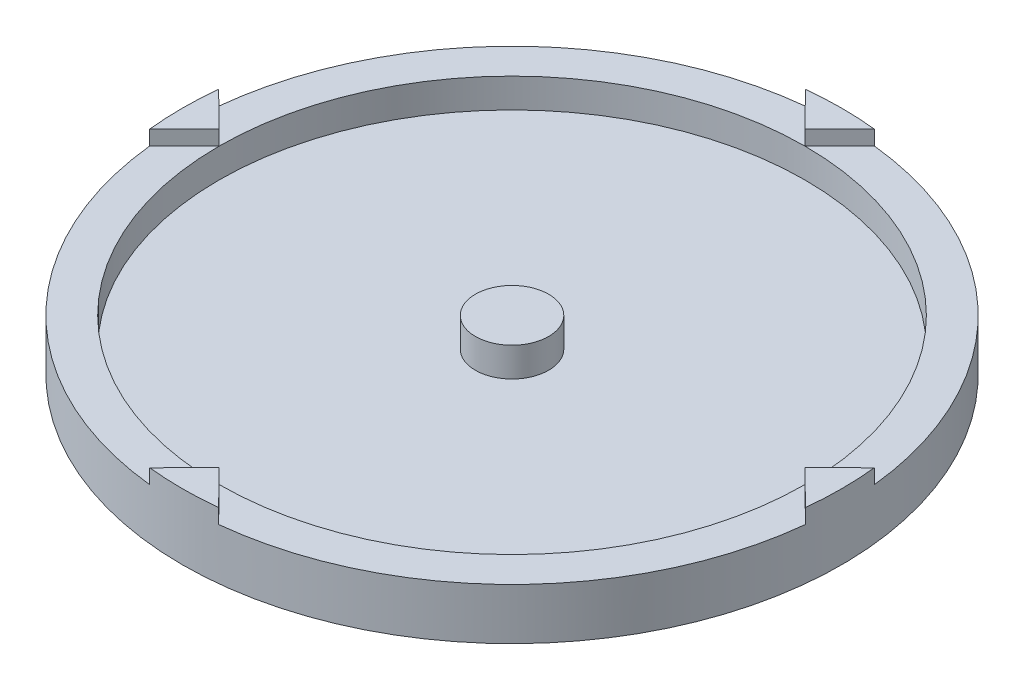
ISO-10303-21;
HEADER;
FILE_DESCRIPTION(('STEP AP214'),'2;1');
FILE_NAME('part.step','',(''),(''),'','','');
FILE_SCHEMA(('AUTOMOTIVE_DESIGN { 1 0 10303 214 1 1 1 1 }'));
ENDSEC;
DATA;
#1=APPLICATION_CONTEXT('core data for automotive mechanical design processes');
#2=APPLICATION_PROTOCOL_DEFINITION('international standard','automotive_design',2000,#1);
#3=PRODUCT_CONTEXT('',#1,'mechanical');
#4=PRODUCT('Part','Part','',(#3));
#5=PRODUCT_RELATED_PRODUCT_CATEGORY('part','',(#4));
#6=PRODUCT_DEFINITION_FORMATION('','',#4);
#7=PRODUCT_DEFINITION_CONTEXT('part definition',#1,'design');
#8=PRODUCT_DEFINITION('design','',#6,#7);
#9=PRODUCT_DEFINITION_SHAPE('','',#8);
#10=(LENGTH_UNIT() NAMED_UNIT(*) SI_UNIT(.MILLI.,.METRE.));
#11=(NAMED_UNIT(*) PLANE_ANGLE_UNIT() SI_UNIT($,.RADIAN.));
#12=(NAMED_UNIT(*) SI_UNIT($,.STERADIAN.) SOLID_ANGLE_UNIT());
#13=UNCERTAINTY_MEASURE_WITH_UNIT(LENGTH_MEASURE(1.E-05),#10,'distance_accuracy_value','');
#14=(GEOMETRIC_REPRESENTATION_CONTEXT(3) GLOBAL_UNCERTAINTY_ASSIGNED_CONTEXT((#13)) GLOBAL_UNIT_ASSIGNED_CONTEXT((#10,
#11,#12)) REPRESENTATION_CONTEXT('',''));
#15=CARTESIAN_POINT('',(0.,0.,0.));
#16=DIRECTION('',(0.,0.,1.));
#17=DIRECTION('',(1.,0.,0.));
#18=AXIS2_PLACEMENT_3D('',#15,#16,#17);
#19=CARTESIAN_POINT('',(0.,7.,0.));
#20=DIRECTION('',(0.,1.,0.));
#21=DIRECTION('',(0.,0.,1.));
#22=AXIS2_PLACEMENT_3D('',#19,#20,#21);
#23=PLANE('',#22);
#24=CARTESIAN_POINT('',(0.,7.,0.));
#25=DIRECTION('',(0.,1.,0.));
#26=DIRECTION('',(0.,0.,1.));
#27=AXIS2_PLACEMENT_3D('',#24,#25,#26);
#28=CIRCLE('',#27,40.);
#29=CARTESIAN_POINT('',(40.,7.,-4.1286418728248E-13));
#30=VERTEX_POINT('',#29);
#31=CARTESIAN_POINT('',(0.,7.,-40.));
#32=VERTEX_POINT('',#31);
#33=EDGE_CURVE('E215',#30,#32,#28,.T.);
#34=ORIENTED_EDGE('',*,*,#33,.F.);
#35=DIRECTION('',(-0.710813297070414,0.,0.703380733819095));
#36=VECTOR('',#35,1.);
#37=CARTESIAN_POINT('',(40.,7.,-4.18977760661176E-13));
#38=LINE('',#37,#36);
#39=CARTESIAN_POINT('',(44.7534852915722,7.,-4.70378084704491));
#40=VERTEX_POINT('',#39);
#41=EDGE_CURVE('E508',#40,#30,#38,.T.);
#42=ORIENTED_EDGE('',*,*,#41,.F.);
#43=CARTESIAN_POINT('',(0.,7.,0.));
#44=DIRECTION('',(0.,1.,0.));
#45=DIRECTION('',(0.,0.,1.));
#46=AXIS2_PLACEMENT_3D('',#43,#44,#45);
#47=CIRCLE('',#46,45.);
#48=CARTESIAN_POINT('',(4.7037808470444,7.,-44.7534852915723));
#49=VERTEX_POINT('',#48);
#50=EDGE_CURVE('E142',#40,#49,#47,.T.);
#51=ORIENTED_EDGE('',*,*,#50,.T.);
#52=DIRECTION('',(0.703380733819085,0.,-0.710813297070424));
#53=VECTOR('',#52,1.);
#54=CARTESIAN_POINT('',(4.70378084704442,7.,-44.7534852915723));
#55=LINE('',#54,#53);
#56=EDGE_CURVE('E195',#32,#49,#55,.T.);
#57=ORIENTED_EDGE('',*,*,#56,.F.);
#58=EDGE_LOOP('',(#34,#42,#51,#57));
#59=FACE_BOUND('',#58,.T.);
#60=ADVANCED_FACE('F32',(#59),#23,.T.);
#61=CARTESIAN_POINT('',(4.70378084704444,7.,44.7534852915723));
#62=VERTEX_POINT('',#61);
#63=CARTESIAN_POINT('',(44.7534852915723,7.,4.70378084704395));
#64=VERTEX_POINT('',#63);
#65=EDGE_CURVE('E47',#62,#64,#47,.T.);
#66=ORIENTED_EDGE('',*,*,#65,.T.);
#67=DIRECTION('',(0.710813297070431,0.,0.703380733819077));
#68=VECTOR('',#67,1.);
#69=CARTESIAN_POINT('',(44.7534852915724,7.,4.70378084704395));
#70=LINE('',#69,#68);
#71=EDGE_CURVE('E51',#30,#64,#70,.T.);
#72=ORIENTED_EDGE('',*,*,#71,.F.);
#73=CARTESIAN_POINT('',(0.,7.,40.));
#74=VERTEX_POINT('',#73);
#75=EDGE_CURVE('E251',#74,#30,#28,.T.);
#76=ORIENTED_EDGE('',*,*,#75,.F.);
#77=DIRECTION('',(-0.703380733819087,0.,-0.710813297070421));
#78=VECTOR('',#77,1.);
#79=CARTESIAN_POINT('',(0.,7.,40.));
#80=LINE('',#79,#78);
#81=EDGE_CURVE('E144',#62,#74,#80,.T.);
#82=ORIENTED_EDGE('',*,*,#81,.F.);
#83=EDGE_LOOP('',(#66,#72,#76,#82));
#84=FACE_BOUND('',#83,.T.);
#85=ADVANCED_FACE('F249',(#84),#23,.T.);
#86=CARTESIAN_POINT('',(-44.7534852915723,7.,4.7037808470446));
#87=VERTEX_POINT('',#86);
#88=CARTESIAN_POINT('',(-4.70378084704442,7.,44.7534852915723));
#89=VERTEX_POINT('',#88);
#90=EDGE_CURVE('E227',#87,#89,#47,.T.);
#91=ORIENTED_EDGE('',*,*,#90,.T.);
#92=DIRECTION('',(-0.703380733819085,0.,0.710813297070424));
#93=VECTOR('',#92,1.);
#94=CARTESIAN_POINT('',(-4.70378084704442,7.,44.7534852915723));
#95=LINE('',#94,#93);
#96=EDGE_CURVE('E147',#74,#89,#95,.T.);
#97=ORIENTED_EDGE('',*,*,#96,.F.);
#98=CARTESIAN_POINT('',(-40.,7.,1.38777878078145E-13));
#99=VERTEX_POINT('',#98);
#100=EDGE_CURVE('E225',#99,#74,#28,.T.);
#101=ORIENTED_EDGE('',*,*,#100,.F.);
#102=DIRECTION('',(0.710813297070419,0.,-0.70338073381909));
#103=VECTOR('',#102,1.);
#104=CARTESIAN_POINT('',(-40.,7.,1.39659253553725E-13));
#105=LINE('',#104,#103);
#106=EDGE_CURVE('E171',#87,#99,#105,.T.);
#107=ORIENTED_EDGE('',*,*,#106,.F.);
#108=EDGE_LOOP('',(#91,#97,#101,#107));
#109=FACE_BOUND('',#108,.T.);
#110=ADVANCED_FACE('F235',(#109),#23,.T.);
#111=CARTESIAN_POINT('',(-4.70378084704444,7.,-44.7534852915723));
#112=VERTEX_POINT('',#111);
#113=CARTESIAN_POINT('',(-44.7534852915723,7.,-4.70378084704426));
#114=VERTEX_POINT('',#113);
#115=EDGE_CURVE('E40',#112,#114,#47,.T.);
#116=ORIENTED_EDGE('',*,*,#115,.T.);
#117=DIRECTION('',(-0.710813297070426,0.,-0.703380733819082));
#118=VECTOR('',#117,1.);
#119=CARTESIAN_POINT('',(-44.7534852915723,7.,-4.70378084704426));
#120=LINE('',#119,#118);
#121=EDGE_CURVE('E176',#99,#114,#120,.T.);
#122=ORIENTED_EDGE('',*,*,#121,.F.);
#123=EDGE_CURVE('E222',#32,#99,#28,.T.);
#124=ORIENTED_EDGE('',*,*,#123,.F.);
#125=DIRECTION('',(0.703380733819087,0.,0.710813297070421));
#126=VECTOR('',#125,1.);
#127=CARTESIAN_POINT('',(0.,7.,-40.));
#128=LINE('',#127,#126);
#129=EDGE_CURVE('E190',#112,#32,#128,.T.);
#130=ORIENTED_EDGE('',*,*,#129,.F.);
#131=EDGE_LOOP('',(#116,#122,#124,#130));
#132=FACE_BOUND('',#131,.T.);
#133=ADVANCED_FACE('F258',(#132),#23,.T.);
#134=CARTESIAN_POINT('',(0.,7.,0.));
#135=DIRECTION('',(0.,-1.,0.));
#136=DIRECTION('',(0.,0.,-1.));
#137=AXIS2_PLACEMENT_3D('',#134,#135,#136);
#138=CYLINDRICAL_SURFACE('',#137,45.);
#139=ORIENTED_EDGE('',*,*,#115,.F.);
#140=DIRECTION('',(0.,-1.,0.));
#141=VECTOR('',#140,1.);
#142=CARTESIAN_POINT('',(-4.70378084704444,9.,-44.7534852915723));
#143=LINE('',#142,#141);
#144=CARTESIAN_POINT('',(-4.70378084704444,9.,-44.7534852915723));
#145=VERTEX_POINT('',#144);
#146=EDGE_CURVE('E208',#145,#112,#143,.T.);
#147=ORIENTED_EDGE('',*,*,#146,.F.);
#148=CARTESIAN_POINT('',(0.,9.,0.));
#149=DIRECTION('',(0.,1.,0.));
#150=DIRECTION('',(0.,0.,-1.));
#151=AXIS2_PLACEMENT_3D('',#148,#149,#150);
#152=CIRCLE('',#151,45.);
#153=CARTESIAN_POINT('',(4.70378084704442,9.,-44.7534852915723));
#154=VERTEX_POINT('',#153);
#155=EDGE_CURVE('E191',#154,#145,#152,.T.);
#156=ORIENTED_EDGE('',*,*,#155,.F.);
#157=DIRECTION('',(0.,-1.,0.));
#158=VECTOR('',#157,1.);
#159=CARTESIAN_POINT('',(4.70378084704442,9.,-44.7534852915723));
#160=LINE('',#159,#158);
#161=EDGE_CURVE('E199',#154,#49,#160,.T.);
#162=ORIENTED_EDGE('',*,*,#161,.T.);
#163=ORIENTED_EDGE('',*,*,#50,.F.);
#164=DIRECTION('',(0.,-1.,0.));
#165=VECTOR('',#164,1.);
#166=CARTESIAN_POINT('',(44.7534852915722,9.,-4.70378084704491));
#167=LINE('',#166,#165);
#168=CARTESIAN_POINT('',(44.7534852915722,9.,-4.70378084704491));
#169=VERTEX_POINT('',#168);
#170=EDGE_CURVE('E125',#169,#40,#167,.T.);
#171=ORIENTED_EDGE('',*,*,#170,.F.);
#172=CARTESIAN_POINT('',(0.,9.,0.));
#173=DIRECTION('',(0.,1.,0.));
#174=DIRECTION('',(1.,0.,0.));
#175=AXIS2_PLACEMENT_3D('',#172,#173,#174);
#176=CIRCLE('',#175,45.);
#177=CARTESIAN_POINT('',(44.7534852915724,9.,4.70378084704395));
#178=VERTEX_POINT('',#177);
#179=EDGE_CURVE('E131',#178,#169,#176,.T.);
#180=ORIENTED_EDGE('',*,*,#179,.F.);
#181=DIRECTION('',(0.,-1.,0.));
#182=VECTOR('',#181,1.);
#183=CARTESIAN_POINT('',(44.7534852915724,9.,4.70378084704395));
#184=LINE('',#183,#182);
#185=EDGE_CURVE('E149',#178,#64,#184,.T.);
#186=ORIENTED_EDGE('',*,*,#185,.T.);
#187=ORIENTED_EDGE('',*,*,#65,.F.);
#188=DIRECTION('',(0.,-1.,0.));
#189=VECTOR('',#188,1.);
#190=CARTESIAN_POINT('',(4.70378084704444,9.,44.7534852915723));
#191=LINE('',#190,#189);
#192=CARTESIAN_POINT('',(4.70378084704444,9.,44.7534852915723));
#193=VERTEX_POINT('',#192);
#194=EDGE_CURVE('E168',#193,#62,#191,.T.);
#195=ORIENTED_EDGE('',*,*,#194,.F.);
#196=CARTESIAN_POINT('',(0.,9.,0.));
#197=DIRECTION('',(0.,1.,0.));
#198=DIRECTION('',(0.,0.,1.));
#199=AXIS2_PLACEMENT_3D('',#196,#197,#198);
#200=CIRCLE('',#199,45.);
#201=CARTESIAN_POINT('',(-4.70378084704442,9.,44.7534852915723));
#202=VERTEX_POINT('',#201);
#203=EDGE_CURVE('E153',#202,#193,#200,.T.);
#204=ORIENTED_EDGE('',*,*,#203,.F.);
#205=DIRECTION('',(0.,-1.,0.));
#206=VECTOR('',#205,1.);
#207=CARTESIAN_POINT('',(-4.70378084704442,9.,44.7534852915723));
#208=LINE('',#207,#206);
#209=EDGE_CURVE('E159',#202,#89,#208,.T.);
#210=ORIENTED_EDGE('',*,*,#209,.T.);
#211=ORIENTED_EDGE('',*,*,#90,.F.);
#212=DIRECTION('',(0.,-1.,0.));
#213=VECTOR('',#212,1.);
#214=CARTESIAN_POINT('',(-44.7534852915723,9.,4.7037808470446));
#215=LINE('',#214,#213);
#216=CARTESIAN_POINT('',(-44.7534852915723,9.,4.7037808470446));
#217=VERTEX_POINT('',#216);
#218=EDGE_CURVE('E188',#217,#87,#215,.T.);
#219=ORIENTED_EDGE('',*,*,#218,.F.);
#220=CARTESIAN_POINT('',(0.,9.,0.));
#221=DIRECTION('',(0.,1.,0.));
#222=DIRECTION('',(-1.,0.,0.));
#223=AXIS2_PLACEMENT_3D('',#220,#221,#222);
#224=CIRCLE('',#223,45.);
#225=CARTESIAN_POINT('',(-44.7534852915723,9.,-4.70378084704426));
#226=VERTEX_POINT('',#225);
#227=EDGE_CURVE('E172',#226,#217,#224,.T.);
#228=ORIENTED_EDGE('',*,*,#227,.F.);
#229=DIRECTION('',(0.,-1.,0.));
#230=VECTOR('',#229,1.);
#231=CARTESIAN_POINT('',(-44.7534852915723,9.,-4.70378084704426));
#232=LINE('',#231,#230);
#233=EDGE_CURVE('E180',#226,#114,#232,.T.);
#234=ORIENTED_EDGE('',*,*,#233,.T.);
#235=EDGE_LOOP('',(#139,#147,#156,#162,#163,#171,#180,#186,#187,#195,#204,#210,#211,#219,#228,#234));
#236=FACE_BOUND('',#235,.T.);
#237=CARTESIAN_POINT('',(0.,0.,0.));
#238=DIRECTION('',(0.,1.,0.));
#239=DIRECTION('',(0.,0.,1.));
#240=AXIS2_PLACEMENT_3D('',#237,#238,#239);
#241=CIRCLE('',#240,45.);
#242=CARTESIAN_POINT('',(0.,0.,45.));
#243=VERTEX_POINT('',#242);
#244=EDGE_CURVE('E221',#243,#243,#241,.T.);
#245=ORIENTED_EDGE('',*,*,#244,.T.);
#246=EDGE_LOOP('',(#245));
#247=FACE_BOUND('',#246,.T.);
#248=ADVANCED_FACE('F34',(#236,#247),#138,.T.);
#249=CARTESIAN_POINT('',(0.,0.,0.));
#250=DIRECTION('',(0.,1.,0.));
#251=DIRECTION('',(0.,0.,1.));
#252=AXIS2_PLACEMENT_3D('',#249,#250,#251);
#253=PLANE('',#252);
#254=CARTESIAN_POINT('',(30.,0.,0.));
#255=DIRECTION('',(0.,1.,0.));
#256=DIRECTION('',(0.,0.,-1.));
#257=AXIS2_PLACEMENT_3D('',#254,#255,#256);
#258=CIRCLE('',#257,4.9);
#259=CARTESIAN_POINT('',(30.,0.,-4.9));
#260=VERTEX_POINT('',#259);
#261=EDGE_CURVE('E505',#260,#260,#258,.T.);
#262=ORIENTED_EDGE('',*,*,#261,.T.);
#263=EDGE_LOOP('',(#262));
#264=FACE_BOUND('',#263,.T.);
#265=CARTESIAN_POINT('',(-30.,0.,0.));
#266=DIRECTION('',(0.,1.,0.));
#267=DIRECTION('',(0.,0.,1.));
#268=AXIS2_PLACEMENT_3D('',#265,#266,#267);
#269=CIRCLE('',#268,4.9);
#270=CARTESIAN_POINT('',(-30.,0.,4.9));
#271=VERTEX_POINT('',#270);
#272=EDGE_CURVE('E11',#271,#271,#269,.F.);
#273=ORIENTED_EDGE('',*,*,#272,.F.);
#274=EDGE_LOOP('',(#273));
#275=FACE_BOUND('',#274,.T.);
#276=ORIENTED_EDGE('',*,*,#244,.F.);
#277=EDGE_LOOP('',(#276));
#278=FACE_BOUND('',#277,.T.);
#279=ADVANCED_FACE('F299',(#264,#275,#278),#253,.F.);
#280=CARTESIAN_POINT('',(0.,3.,0.));
#281=DIRECTION('',(0.,1.,0.));
#282=DIRECTION('',(0.,0.,1.));
#283=AXIS2_PLACEMENT_3D('',#280,#281,#282);
#284=CYLINDRICAL_SURFACE('',#283,40.);
#285=CARTESIAN_POINT('',(0.,3.,0.));
#286=DIRECTION('',(0.,1.,0.));
#287=DIRECTION('',(0.,0.,1.));
#288=AXIS2_PLACEMENT_3D('',#285,#286,#287);
#289=CIRCLE('',#288,40.);
#290=CARTESIAN_POINT('',(0.,3.,40.));
#291=VERTEX_POINT('',#290);
#292=EDGE_CURVE('E218',#291,#291,#289,.T.);
#293=ORIENTED_EDGE('',*,*,#292,.F.);
#294=EDGE_LOOP('',(#293));
#295=FACE_BOUND('',#294,.T.);
#296=ORIENTED_EDGE('',*,*,#123,.T.);
#297=ORIENTED_EDGE('',*,*,#100,.T.);
#298=ORIENTED_EDGE('',*,*,#75,.T.);
#299=ORIENTED_EDGE('',*,*,#33,.T.);
#300=EDGE_LOOP('',(#296,#297,#298,#299));
#301=FACE_BOUND('',#300,.T.);
#302=ADVANCED_FACE('F254',(#295,#301),#284,.F.);
#303=CARTESIAN_POINT('',(0.,3.,0.));
#304=DIRECTION('',(0.,1.,0.));
#305=DIRECTION('',(0.,0.,1.));
#306=AXIS2_PLACEMENT_3D('',#303,#304,#305);
#307=PLANE('',#306);
#308=CARTESIAN_POINT('',(0.,3.,0.));
#309=DIRECTION('',(0.,1.,0.));
#310=DIRECTION('',(0.,0.,1.));
#311=AXIS2_PLACEMENT_3D('',#308,#309,#310);
#312=CIRCLE('',#311,5.);
#313=CARTESIAN_POINT('',(0.,3.,5.));
#314=VERTEX_POINT('',#313);
#315=EDGE_CURVE('E211',#314,#314,#312,.T.);
#316=ORIENTED_EDGE('',*,*,#315,.F.);
#317=EDGE_LOOP('',(#316));
#318=FACE_BOUND('',#317,.T.);
#319=ORIENTED_EDGE('',*,*,#292,.T.);
#320=EDGE_LOOP('',(#319));
#321=FACE_BOUND('',#320,.T.);
#322=ADVANCED_FACE('F358',(#318,#321),#307,.T.);
#323=CARTESIAN_POINT('',(0.,7.,0.));
#324=DIRECTION('',(0.,-1.,0.));
#325=DIRECTION('',(0.,0.,-1.));
#326=AXIS2_PLACEMENT_3D('',#323,#324,#325);
#327=CYLINDRICAL_SURFACE('',#326,5.);
#328=CARTESIAN_POINT('',(0.,7.,0.));
#329=DIRECTION('',(0.,1.,0.));
#330=DIRECTION('',(0.,0.,1.));
#331=AXIS2_PLACEMENT_3D('',#328,#329,#330);
#332=CIRCLE('',#331,5.);
#333=CARTESIAN_POINT('',(0.,7.,5.));
#334=VERTEX_POINT('',#333);
#335=EDGE_CURVE('E212',#334,#334,#332,.T.);
#336=ORIENTED_EDGE('',*,*,#335,.F.);
#337=EDGE_LOOP('',(#336));
#338=FACE_BOUND('',#337,.T.);
#339=ORIENTED_EDGE('',*,*,#315,.T.);
#340=EDGE_LOOP('',(#339));
#341=FACE_BOUND('',#340,.T.);
#342=ADVANCED_FACE('F348',(#338,#341),#327,.T.);
#343=CARTESIAN_POINT('',(0.,7.,0.));
#344=DIRECTION('',(0.,1.,0.));
#345=DIRECTION('',(0.,0.,1.));
#346=AXIS2_PLACEMENT_3D('',#343,#344,#345);
#347=PLANE('',#346);
#348=ORIENTED_EDGE('',*,*,#335,.T.);
#349=EDGE_LOOP('',(#348));
#350=FACE_BOUND('',#349,.T.);
#351=ADVANCED_FACE('F338',(#350),#347,.T.);
#352=CARTESIAN_POINT('',(0.,9.,-40.));
#353=DIRECTION('',(0.710813297070421,0.,-0.703380733819087));
#354=DIRECTION('',(-0.703380733819087,0.,-0.710813297070421));
#355=AXIS2_PLACEMENT_3D('',#352,#353,#354);
#356=PLANE('',#355);
#357=ORIENTED_EDGE('',*,*,#129,.T.);
#358=DIRECTION('',(0.,-1.,0.));
#359=VECTOR('',#358,1.);
#360=CARTESIAN_POINT('',(0.,9.,-40.));
#361=LINE('',#360,#359);
#362=CARTESIAN_POINT('',(0.,9.,-40.));
#363=VERTEX_POINT('',#362);
#364=EDGE_CURVE('E205',#363,#32,#361,.T.);
#365=ORIENTED_EDGE('',*,*,#364,.F.);
#366=DIRECTION('',(0.703380733819087,0.,0.710813297070421));
#367=VECTOR('',#366,1.);
#368=CARTESIAN_POINT('',(0.,9.,-40.));
#369=LINE('',#368,#367);
#370=EDGE_CURVE('E194',#145,#363,#369,.T.);
#371=ORIENTED_EDGE('',*,*,#370,.F.);
#372=ORIENTED_EDGE('',*,*,#146,.T.);
#373=EDGE_LOOP('',(#357,#365,#371,#372));
#374=FACE_BOUND('',#373,.T.);
#375=ADVANCED_FACE('F263',(#374),#356,.F.);
#376=CARTESIAN_POINT('',(4.70378084704442,9.,-44.7534852915723));
#377=DIRECTION('',(-0.710813297070424,0.,-0.703380733819085));
#378=DIRECTION('',(-0.703380733819085,0.,0.710813297070424));
#379=AXIS2_PLACEMENT_3D('',#376,#377,#378);
#380=PLANE('',#379);
#381=ORIENTED_EDGE('',*,*,#56,.T.);
#382=ORIENTED_EDGE('',*,*,#161,.F.);
#383=DIRECTION('',(0.703380733819085,0.,-0.710813297070424));
#384=VECTOR('',#383,1.);
#385=CARTESIAN_POINT('',(4.70378084704442,9.,-44.7534852915723));
#386=LINE('',#385,#384);
#387=EDGE_CURVE('E197',#363,#154,#386,.T.);
#388=ORIENTED_EDGE('',*,*,#387,.F.);
#389=ORIENTED_EDGE('',*,*,#364,.T.);
#390=EDGE_LOOP('',(#381,#382,#388,#389));
#391=FACE_BOUND('',#390,.T.);
#392=ADVANCED_FACE('F266',(#391),#380,.F.);
#393=CARTESIAN_POINT('',(0.,9.,0.));
#394=DIRECTION('',(0.,-1.,0.));
#395=DIRECTION('',(0.,0.,-1.));
#396=AXIS2_PLACEMENT_3D('',#393,#394,#395);
#397=PLANE('',#396);
#398=ORIENTED_EDGE('',*,*,#155,.T.);
#399=ORIENTED_EDGE('',*,*,#370,.T.);
#400=ORIENTED_EDGE('',*,*,#387,.T.);
#401=EDGE_LOOP('',(#398,#399,#400));
#402=FACE_BOUND('',#401,.T.);
#403=ADVANCED_FACE('F269',(#402),#397,.F.);
#404=CARTESIAN_POINT('',(-40.,9.,1.39659253553725E-13));
#405=DIRECTION('',(-0.703380733819089,0.,-0.710813297070419));
#406=DIRECTION('',(-0.710813297070419,0.,0.70338073381909));
#407=AXIS2_PLACEMENT_3D('',#404,#405,#406);
#408=PLANE('',#407);
#409=ORIENTED_EDGE('',*,*,#106,.T.);
#410=DIRECTION('',(0.,-1.,0.));
#411=VECTOR('',#410,1.);
#412=CARTESIAN_POINT('',(-40.,9.,1.39659253553725E-13));
#413=LINE('',#412,#411);
#414=CARTESIAN_POINT('',(-40.,9.,1.39659253553725E-13));
#415=VERTEX_POINT('',#414);
#416=EDGE_CURVE('E186',#415,#99,#413,.T.);
#417=ORIENTED_EDGE('',*,*,#416,.F.);
#418=DIRECTION('',(0.710813297070419,0.,-0.70338073381909));
#419=VECTOR('',#418,1.);
#420=CARTESIAN_POINT('',(-40.,9.,1.39659253553725E-13));
#421=LINE('',#420,#419);
#422=EDGE_CURVE('E175',#217,#415,#421,.T.);
#423=ORIENTED_EDGE('',*,*,#422,.F.);
#424=ORIENTED_EDGE('',*,*,#218,.T.);
#425=EDGE_LOOP('',(#409,#417,#423,#424));
#426=FACE_BOUND('',#425,.T.);
#427=ADVANCED_FACE('F277',(#426),#408,.F.);
#428=CARTESIAN_POINT('',(-44.7534852915723,9.,-4.70378084704426));
#429=DIRECTION('',(-0.703380733819082,0.,0.710813297070426));
#430=DIRECTION('',(0.710813297070426,0.,0.703380733819082));
#431=AXIS2_PLACEMENT_3D('',#428,#429,#430);
#432=PLANE('',#431);
#433=ORIENTED_EDGE('',*,*,#121,.T.);
#434=ORIENTED_EDGE('',*,*,#233,.F.);
#435=DIRECTION('',(-0.710813297070426,0.,-0.703380733819082));
#436=VECTOR('',#435,1.);
#437=CARTESIAN_POINT('',(-44.7534852915723,9.,-4.70378084704426));
#438=LINE('',#437,#436);
#439=EDGE_CURVE('E178',#415,#226,#438,.T.);
#440=ORIENTED_EDGE('',*,*,#439,.F.);
#441=ORIENTED_EDGE('',*,*,#416,.T.);
#442=EDGE_LOOP('',(#433,#434,#440,#441));
#443=FACE_BOUND('',#442,.T.);
#444=ADVANCED_FACE('F274',(#443),#432,.F.);
#445=CARTESIAN_POINT('',(0.,9.,0.));
#446=DIRECTION('',(0.,-1.,0.));
#447=DIRECTION('',(-1.,0.,0.));
#448=AXIS2_PLACEMENT_3D('',#445,#446,#447);
#449=PLANE('',#448);
#450=ORIENTED_EDGE('',*,*,#227,.T.);
#451=ORIENTED_EDGE('',*,*,#422,.T.);
#452=ORIENTED_EDGE('',*,*,#439,.T.);
#453=EDGE_LOOP('',(#450,#451,#452));
#454=FACE_BOUND('',#453,.T.);
#455=ADVANCED_FACE('F279',(#454),#449,.F.);
#456=CARTESIAN_POINT('',(0.,9.,40.));
#457=DIRECTION('',(-0.710813297070421,0.,0.703380733819087));
#458=DIRECTION('',(0.703380733819087,0.,0.710813297070421));
#459=AXIS2_PLACEMENT_3D('',#456,#457,#458);
#460=PLANE('',#459);
#461=ORIENTED_EDGE('',*,*,#81,.T.);
#462=DIRECTION('',(0.,-1.,0.));
#463=VECTOR('',#462,1.);
#464=CARTESIAN_POINT('',(0.,9.,40.));
#465=LINE('',#464,#463);
#466=CARTESIAN_POINT('',(0.,9.,40.));
#467=VERTEX_POINT('',#466);
#468=EDGE_CURVE('E165',#467,#74,#465,.T.);
#469=ORIENTED_EDGE('',*,*,#468,.F.);
#470=DIRECTION('',(-0.703380733819087,0.,-0.710813297070421));
#471=VECTOR('',#470,1.);
#472=CARTESIAN_POINT('',(0.,9.,40.));
#473=LINE('',#472,#471);
#474=EDGE_CURVE('E156',#193,#467,#473,.T.);
#475=ORIENTED_EDGE('',*,*,#474,.F.);
#476=ORIENTED_EDGE('',*,*,#194,.T.);
#477=EDGE_LOOP('',(#461,#469,#475,#476));
#478=FACE_BOUND('',#477,.T.);
#479=ADVANCED_FACE('F248',(#478),#460,.F.);
#480=CARTESIAN_POINT('',(-4.70378084704442,9.,44.7534852915723));
#481=DIRECTION('',(0.710813297070424,0.,0.703380733819085));
#482=DIRECTION('',(0.703380733819085,0.,-0.710813297070424));
#483=AXIS2_PLACEMENT_3D('',#480,#481,#482);
#484=PLANE('',#483);
#485=ORIENTED_EDGE('',*,*,#96,.T.);
#486=ORIENTED_EDGE('',*,*,#209,.F.);
#487=DIRECTION('',(-0.703380733819085,0.,0.710813297070424));
#488=VECTOR('',#487,1.);
#489=CARTESIAN_POINT('',(-4.70378084704442,9.,44.7534852915723));
#490=LINE('',#489,#488);
#491=EDGE_CURVE('E158',#467,#202,#490,.T.);
#492=ORIENTED_EDGE('',*,*,#491,.F.);
#493=ORIENTED_EDGE('',*,*,#468,.T.);
#494=EDGE_LOOP('',(#485,#486,#492,#493));
#495=FACE_BOUND('',#494,.T.);
#496=ADVANCED_FACE('F240',(#495),#484,.F.);
#497=CARTESIAN_POINT('',(0.,9.,0.));
#498=DIRECTION('',(0.,-1.,0.));
#499=DIRECTION('',(0.,0.,1.));
#500=AXIS2_PLACEMENT_3D('',#497,#498,#499);
#501=PLANE('',#500);
#502=ORIENTED_EDGE('',*,*,#203,.T.);
#503=ORIENTED_EDGE('',*,*,#474,.T.);
#504=ORIENTED_EDGE('',*,*,#491,.T.);
#505=EDGE_LOOP('',(#502,#503,#504));
#506=FACE_BOUND('',#505,.T.);
#507=ADVANCED_FACE('F246',(#506),#501,.F.);
#508=CARTESIAN_POINT('',(40.,9.,-4.18977760661176E-13));
#509=DIRECTION('',(0.703380733819094,0.,0.710813297070414));
#510=DIRECTION('',(0.710813297070414,0.,-0.703380733819094));
#511=AXIS2_PLACEMENT_3D('',#508,#509,#510);
#512=PLANE('',#511);
#513=ORIENTED_EDGE('',*,*,#41,.T.);
#514=DIRECTION('',(0.,-1.,0.));
#515=VECTOR('',#514,1.);
#516=CARTESIAN_POINT('',(40.,9.,-4.18977760661176E-13));
#517=LINE('',#516,#515);
#518=CARTESIAN_POINT('',(40.,9.,-4.18977760661176E-13));
#519=VERTEX_POINT('',#518);
#520=EDGE_CURVE('E127',#519,#30,#517,.T.);
#521=ORIENTED_EDGE('',*,*,#520,.F.);
#522=DIRECTION('',(-0.710813297070414,0.,0.703380733819095));
#523=VECTOR('',#522,1.);
#524=CARTESIAN_POINT('',(40.,9.,-4.18977760661176E-13));
#525=LINE('',#524,#523);
#526=EDGE_CURVE('E120',#169,#519,#525,.T.);
#527=ORIENTED_EDGE('',*,*,#526,.F.);
#528=ORIENTED_EDGE('',*,*,#170,.T.);
#529=EDGE_LOOP('',(#513,#521,#527,#528));
#530=FACE_BOUND('',#529,.T.);
#531=ADVANCED_FACE('F123',(#530),#512,.F.);
#532=CARTESIAN_POINT('',(44.7534852915724,9.,4.70378084704395));
#533=DIRECTION('',(0.703380733819077,0.,-0.710813297070431));
#534=DIRECTION('',(-0.710813297070431,0.,-0.703380733819077));
#535=AXIS2_PLACEMENT_3D('',#532,#533,#534);
#536=PLANE('',#535);
#537=ORIENTED_EDGE('',*,*,#71,.T.);
#538=ORIENTED_EDGE('',*,*,#185,.F.);
#539=DIRECTION('',(0.710813297070431,0.,0.703380733819077));
#540=VECTOR('',#539,1.);
#541=CARTESIAN_POINT('',(44.7534852915724,9.,4.70378084704395));
#542=LINE('',#541,#540);
#543=EDGE_CURVE('E130',#519,#178,#542,.T.);
#544=ORIENTED_EDGE('',*,*,#543,.F.);
#545=ORIENTED_EDGE('',*,*,#520,.T.);
#546=EDGE_LOOP('',(#537,#538,#544,#545));
#547=FACE_BOUND('',#546,.T.);
#548=ADVANCED_FACE('F440',(#547),#536,.F.);
#549=CARTESIAN_POINT('',(0.,9.,0.));
#550=DIRECTION('',(0.,-1.,0.));
#551=DIRECTION('',(1.,0.,0.));
#552=AXIS2_PLACEMENT_3D('',#549,#550,#551);
#553=PLANE('',#552);
#554=ORIENTED_EDGE('',*,*,#179,.T.);
#555=ORIENTED_EDGE('',*,*,#526,.T.);
#556=ORIENTED_EDGE('',*,*,#543,.T.);
#557=EDGE_LOOP('',(#554,#555,#556));
#558=FACE_BOUND('',#557,.T.);
#559=ADVANCED_FACE('F134',(#558),#553,.F.);
#560=CARTESIAN_POINT('',(-30.,-8.,0.));
#561=DIRECTION('',(0.,1.,0.));
#562=DIRECTION('',(0.,0.,1.));
#563=AXIS2_PLACEMENT_3D('',#560,#561,#562);
#564=CYLINDRICAL_SURFACE('',#563,4.9);
#565=CARTESIAN_POINT('',(-30.,-8.,0.));
#566=DIRECTION('',(0.,-1.,0.));
#567=DIRECTION('',(0.,0.,-1.));
#568=AXIS2_PLACEMENT_3D('',#565,#566,#567);
#569=CIRCLE('',#568,4.9);
#570=CARTESIAN_POINT('',(-30.,-8.,-4.9));
#571=VERTEX_POINT('',#570);
#572=EDGE_CURVE('E504',#571,#571,#569,.T.);
#573=ORIENTED_EDGE('',*,*,#572,.F.);
#574=EDGE_LOOP('',(#573));
#575=FACE_BOUND('',#574,.T.);
#576=ORIENTED_EDGE('',*,*,#272,.T.);
#577=EDGE_LOOP('',(#576));
#578=FACE_BOUND('',#577,.T.);
#579=ADVANCED_FACE('F456',(#575,#578),#564,.T.);
#580=CARTESIAN_POINT('',(-30.,-8.,0.));
#581=DIRECTION('',(0.,-1.,0.));
#582=DIRECTION('',(0.,0.,-1.));
#583=AXIS2_PLACEMENT_3D('',#580,#581,#582);
#584=PLANE('',#583);
#585=ORIENTED_EDGE('',*,*,#572,.T.);
#586=EDGE_LOOP('',(#585));
#587=FACE_BOUND('',#586,.T.);
#588=ADVANCED_FACE('F464',(#587),#584,.T.);
#589=CARTESIAN_POINT('',(30.,-8.,0.));
#590=DIRECTION('',(0.,1.,0.));
#591=DIRECTION('',(0.,0.,1.));
#592=AXIS2_PLACEMENT_3D('',#589,#590,#591);
#593=CYLINDRICAL_SURFACE('',#592,4.9);
#594=CARTESIAN_POINT('',(30.,-8.,0.));
#595=DIRECTION('',(0.,1.,0.));
#596=DIRECTION('',(0.,0.,-1.));
#597=AXIS2_PLACEMENT_3D('',#594,#595,#596);
#598=CIRCLE('',#597,4.9);
#599=CARTESIAN_POINT('',(30.,-8.,-4.9));
#600=VERTEX_POINT('',#599);
#601=EDGE_CURVE('E503',#600,#600,#598,.T.);
#602=ORIENTED_EDGE('',*,*,#601,.T.);
#603=EDGE_LOOP('',(#602));
#604=FACE_BOUND('',#603,.T.);
#605=ORIENTED_EDGE('',*,*,#261,.F.);
#606=EDGE_LOOP('',(#605));
#607=FACE_BOUND('',#606,.T.);
#608=ADVANCED_FACE('F472',(#604,#607),#593,.T.);
#609=CARTESIAN_POINT('',(30.,-8.,0.));
#610=DIRECTION('',(0.,-1.,0.));
#611=DIRECTION('',(0.,0.,-1.));
#612=AXIS2_PLACEMENT_3D('',#609,#610,#611);
#613=PLANE('',#612);
#614=ORIENTED_EDGE('',*,*,#601,.F.);
#615=EDGE_LOOP('',(#614));
#616=FACE_BOUND('',#615,.T.);
#617=ADVANCED_FACE('F480',(#616),#613,.T.);
#618=CLOSED_SHELL('',(#60,#85,#110,#133,#248,#279,#302,#322,#342,#351,#375,#392,#403,#427,#444,
#455,#479,#496,#507,#531,#548,#559,#579,#588,#608,#617));
#619=MANIFOLD_SOLID_BREP('B2',#618);
#620=ADVANCED_BREP_SHAPE_REPRESENTATION('',(#18,#619),#14);
#621=SHAPE_DEFINITION_REPRESENTATION(#9,#620);
ENDSEC;
END-ISO-10303-21;
